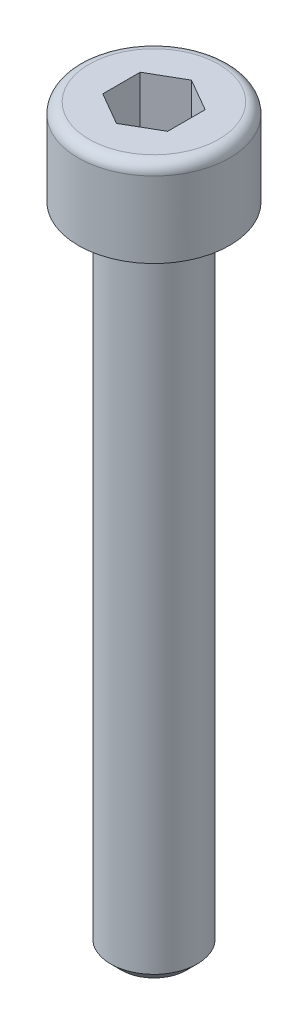
ISO-10303-21;
HEADER;
FILE_DESCRIPTION(('STEP AP214'),'2;1');
FILE_NAME('part.step','',(''),(''),'','','');
FILE_SCHEMA(('AUTOMOTIVE_DESIGN { 1 0 10303 214 1 1 1 1 }'));
ENDSEC;
DATA;
#1=APPLICATION_CONTEXT('core data for automotive mechanical design processes');
#2=APPLICATION_PROTOCOL_DEFINITION('international standard','automotive_design',2000,#1);
#3=PRODUCT_CONTEXT('',#1,'mechanical');
#4=PRODUCT('Part','Part','',(#3));
#5=PRODUCT_RELATED_PRODUCT_CATEGORY('part','',(#4));
#6=PRODUCT_DEFINITION_FORMATION('','',#4);
#7=PRODUCT_DEFINITION_CONTEXT('part definition',#1,'design');
#8=PRODUCT_DEFINITION('design','',#6,#7);
#9=PRODUCT_DEFINITION_SHAPE('','',#8);
#10=(LENGTH_UNIT() NAMED_UNIT(*) SI_UNIT(.MILLI.,.METRE.));
#11=(NAMED_UNIT(*) PLANE_ANGLE_UNIT() SI_UNIT($,.RADIAN.));
#12=(NAMED_UNIT(*) SI_UNIT($,.STERADIAN.) SOLID_ANGLE_UNIT());
#13=UNCERTAINTY_MEASURE_WITH_UNIT(LENGTH_MEASURE(1.E-05),#10,'distance_accuracy_value','');
#14=(GEOMETRIC_REPRESENTATION_CONTEXT(3) GLOBAL_UNCERTAINTY_ASSIGNED_CONTEXT((#13)) GLOBAL_UNIT_ASSIGNED_CONTEXT((#10,
#11,#12)) REPRESENTATION_CONTEXT('',''));
#15=CARTESIAN_POINT('',(0.,0.,0.));
#16=DIRECTION('',(0.,0.,1.));
#17=DIRECTION('',(1.,0.,0.));
#18=AXIS2_PLACEMENT_3D('',#15,#16,#17);
#19=CARTESIAN_POINT('',(0.,0.,0.));
#20=DIRECTION('',(0.,-1.,0.));
#21=DIRECTION('',(0.,0.,-1.));
#22=AXIS2_PLACEMENT_3D('',#19,#20,#21);
#23=PLANE('',#22);
#24=CARTESIAN_POINT('',(0.,0.,0.));
#25=DIRECTION('',(0.,-1.,0.));
#26=DIRECTION('',(0.,0.,-1.));
#27=AXIS2_PLACEMENT_3D('',#24,#25,#26);
#28=CIRCLE('',#27,3.);
#29=CARTESIAN_POINT('',(0.,0.,-3.));
#30=VERTEX_POINT('',#29);
#31=EDGE_CURVE('E42',#30,#30,#28,.F.);
#32=ORIENTED_EDGE('',*,*,#31,.T.);
#33=EDGE_LOOP('',(#32));
#34=FACE_BOUND('',#33,.T.);
#35=DIRECTION('',(-0.866025403784439,0.,-0.5));
#36=VECTOR('',#35,1.);
#37=CARTESIAN_POINT('',(1.5,0.,-0.866025403784438));
#38=LINE('',#37,#36);
#39=CARTESIAN_POINT('',(1.5,0.,-0.866025403784438));
#40=VERTEX_POINT('',#39);
#41=CARTESIAN_POINT('',(0.,0.,-1.73205080756888));
#42=VERTEX_POINT('',#41);
#43=EDGE_CURVE('E123',#40,#42,#38,.T.);
#44=ORIENTED_EDGE('',*,*,#43,.F.);
#45=DIRECTION('',(0.,0.,-1.));
#46=VECTOR('',#45,1.);
#47=CARTESIAN_POINT('',(1.5,0.,0.866025403784439));
#48=LINE('',#47,#46);
#49=CARTESIAN_POINT('',(1.5,0.,0.866025403784439));
#50=VERTEX_POINT('',#49);
#51=EDGE_CURVE('E49',#50,#40,#48,.T.);
#52=ORIENTED_EDGE('',*,*,#51,.F.);
#53=DIRECTION('',(0.866025403784439,0.,-0.5));
#54=VECTOR('',#53,1.);
#55=CARTESIAN_POINT('',(0.,0.,1.73205080756888));
#56=LINE('',#55,#54);
#57=CARTESIAN_POINT('',(0.,0.,1.73205080756888));
#58=VERTEX_POINT('',#57);
#59=EDGE_CURVE('E132',#58,#50,#56,.T.);
#60=ORIENTED_EDGE('',*,*,#59,.F.);
#61=DIRECTION('',(0.866025403784439,0.,0.5));
#62=VECTOR('',#61,1.);
#63=CARTESIAN_POINT('',(-1.5,0.,0.866025403784438));
#64=LINE('',#63,#62);
#65=CARTESIAN_POINT('',(-1.5,0.,0.866025403784438));
#66=VERTEX_POINT('',#65);
#67=EDGE_CURVE('E130',#66,#58,#64,.T.);
#68=ORIENTED_EDGE('',*,*,#67,.F.);
#69=DIRECTION('',(0.,0.,1.));
#70=VECTOR('',#69,1.);
#71=CARTESIAN_POINT('',(-1.5,0.,-0.866025403784439));
#72=LINE('',#71,#70);
#73=CARTESIAN_POINT('',(-1.5,0.,-0.866025403784439));
#74=VERTEX_POINT('',#73);
#75=EDGE_CURVE('E97',#74,#66,#72,.T.);
#76=ORIENTED_EDGE('',*,*,#75,.F.);
#77=DIRECTION('',(-0.866025403784439,0.,0.5));
#78=VECTOR('',#77,1.);
#79=CARTESIAN_POINT('',(0.,0.,-1.73205080756888));
#80=LINE('',#79,#78);
#81=EDGE_CURVE('E126',#42,#74,#80,.T.);
#82=ORIENTED_EDGE('',*,*,#81,.F.);
#83=EDGE_LOOP('',(#44,#52,#60,#68,#76,#82));
#84=FACE_BOUND('',#83,.T.);
#85=ADVANCED_FACE('F34',(#34,#84),#23,.F.);
#86=CARTESIAN_POINT('',(0.,0.,0.));
#87=DIRECTION('',(0.,1.,0.));
#88=DIRECTION('',(0.,0.,1.));
#89=AXIS2_PLACEMENT_3D('',#86,#87,#88);
#90=CYLINDRICAL_SURFACE('',#89,3.5);
#91=CARTESIAN_POINT('',(0.,-0.5,0.));
#92=DIRECTION('',(0.,-1.,0.));
#93=DIRECTION('',(0.,0.,-1.));
#94=AXIS2_PLACEMENT_3D('',#91,#92,#93);
#95=CIRCLE('',#94,3.5);
#96=CARTESIAN_POINT('',(0.,-0.5,-3.5));
#97=VERTEX_POINT('',#96);
#98=EDGE_CURVE('E11',#97,#97,#95,.T.);
#99=ORIENTED_EDGE('',*,*,#98,.T.);
#100=EDGE_LOOP('',(#99));
#101=FACE_BOUND('',#100,.T.);
#102=CARTESIAN_POINT('',(0.,-4.,0.));
#103=DIRECTION('',(0.,1.,0.));
#104=DIRECTION('',(0.,0.,1.));
#105=AXIS2_PLACEMENT_3D('',#102,#103,#104);
#106=CIRCLE('',#105,3.5);
#107=CARTESIAN_POINT('',(0.,-4.,3.5));
#108=VERTEX_POINT('',#107);
#109=EDGE_CURVE('E144',#108,#108,#106,.T.);
#110=ORIENTED_EDGE('',*,*,#109,.T.);
#111=EDGE_LOOP('',(#110));
#112=FACE_BOUND('',#111,.T.);
#113=ADVANCED_FACE('F166',(#101,#112),#90,.T.);
#114=CARTESIAN_POINT('',(3.5,-4.,0.));
#115=DIRECTION('',(0.,1.,0.));
#116=DIRECTION('',(0.,0.,1.));
#117=AXIS2_PLACEMENT_3D('',#114,#115,#116);
#118=PLANE('',#117);
#119=ORIENTED_EDGE('',*,*,#109,.F.);
#120=EDGE_LOOP('',(#119));
#121=FACE_BOUND('',#120,.T.);
#122=CARTESIAN_POINT('',(0.,-4.,0.));
#123=DIRECTION('',(0.,1.,0.));
#124=DIRECTION('',(0.,0.,1.));
#125=AXIS2_PLACEMENT_3D('',#122,#123,#124);
#126=CIRCLE('',#125,2.);
#127=CARTESIAN_POINT('',(0.,-4.,2.));
#128=VERTEX_POINT('',#127);
#129=EDGE_CURVE('E136',#128,#128,#126,.T.);
#130=ORIENTED_EDGE('',*,*,#129,.T.);
#131=EDGE_LOOP('',(#130));
#132=FACE_BOUND('',#131,.T.);
#133=ADVANCED_FACE('F171',(#121,#132),#118,.F.);
#134=CARTESIAN_POINT('',(0.,0.,0.));
#135=DIRECTION('',(0.,1.,0.));
#136=DIRECTION('',(0.,0.,1.));
#137=AXIS2_PLACEMENT_3D('',#134,#135,#136);
#138=CYLINDRICAL_SURFACE('',#137,2.);
#139=CARTESIAN_POINT('',(0.,-33.5,0.));
#140=DIRECTION('',(0.,1.,0.));
#141=DIRECTION('',(0.,0.,1.));
#142=AXIS2_PLACEMENT_3D('',#139,#140,#141);
#143=CIRCLE('',#142,2.);
#144=CARTESIAN_POINT('',(0.,-33.5,2.));
#145=VERTEX_POINT('',#144);
#146=EDGE_CURVE('E147',#145,#145,#143,.T.);
#147=ORIENTED_EDGE('',*,*,#146,.T.);
#148=EDGE_LOOP('',(#147));
#149=FACE_BOUND('',#148,.T.);
#150=ORIENTED_EDGE('',*,*,#129,.F.);
#151=EDGE_LOOP('',(#150));
#152=FACE_BOUND('',#151,.T.);
#153=ADVANCED_FACE('F177',(#149,#152),#138,.T.);
#154=CARTESIAN_POINT('',(2.,-34.,0.));
#155=DIRECTION('',(0.,1.,0.));
#156=DIRECTION('',(0.,0.,1.));
#157=AXIS2_PLACEMENT_3D('',#154,#155,#156);
#158=PLANE('',#157);
#159=CARTESIAN_POINT('',(0.,-34.,0.));
#160=DIRECTION('',(0.,1.,0.));
#161=DIRECTION('',(0.,0.,1.));
#162=AXIS2_PLACEMENT_3D('',#159,#160,#161);
#163=CIRCLE('',#162,1.5);
#164=CARTESIAN_POINT('',(0.,-34.,1.5));
#165=VERTEX_POINT('',#164);
#166=EDGE_CURVE('E150',#165,#165,#163,.F.);
#167=ORIENTED_EDGE('',*,*,#166,.T.);
#168=EDGE_LOOP('',(#167));
#169=FACE_BOUND('',#168,.T.);
#170=ADVANCED_FACE('F181',(#169),#158,.F.);
#171=CARTESIAN_POINT('',(1.5,-3.,0.866025403784439));
#172=DIRECTION('',(1.,0.,0.));
#173=DIRECTION('',(0.,0.,-1.));
#174=AXIS2_PLACEMENT_3D('',#171,#172,#173);
#175=PLANE('',#174);
#176=ORIENTED_EDGE('',*,*,#51,.T.);
#177=DIRECTION('',(0.,1.,0.));
#178=VECTOR('',#177,1.);
#179=CARTESIAN_POINT('',(1.5,-3.,-0.866025403784438));
#180=LINE('',#179,#178);
#181=CARTESIAN_POINT('',(1.5,-3.,-0.866025403784438));
#182=VERTEX_POINT('',#181);
#183=EDGE_CURVE('E79',#182,#40,#180,.T.);
#184=ORIENTED_EDGE('',*,*,#183,.F.);
#185=DIRECTION('',(0.,0.,-1.));
#186=VECTOR('',#185,1.);
#187=CARTESIAN_POINT('',(1.5,-3.,0.866025403784439));
#188=LINE('',#187,#186);
#189=CARTESIAN_POINT('',(1.5,-3.,0.866025403784439));
#190=VERTEX_POINT('',#189);
#191=EDGE_CURVE('E134',#190,#182,#188,.T.);
#192=ORIENTED_EDGE('',*,*,#191,.F.);
#193=DIRECTION('',(0.,1.,0.));
#194=VECTOR('',#193,1.);
#195=CARTESIAN_POINT('',(1.5,-3.,0.866025403784439));
#196=LINE('',#195,#194);
#197=EDGE_CURVE('E57',#190,#50,#196,.T.);
#198=ORIENTED_EDGE('',*,*,#197,.T.);
#199=EDGE_LOOP('',(#176,#184,#192,#198));
#200=FACE_BOUND('',#199,.T.);
#201=ADVANCED_FACE('F185',(#200),#175,.F.);
#202=CARTESIAN_POINT('',(0.,-3.,1.73205080756888));
#203=DIRECTION('',(0.5,0.,0.866025403784439));
#204=DIRECTION('',(0.866025403784439,0.,-0.5));
#205=AXIS2_PLACEMENT_3D('',#202,#203,#204);
#206=PLANE('',#205);
#207=ORIENTED_EDGE('',*,*,#59,.T.);
#208=ORIENTED_EDGE('',*,*,#197,.F.);
#209=DIRECTION('',(0.866025403784439,0.,-0.5));
#210=VECTOR('',#209,1.);
#211=CARTESIAN_POINT('',(0.,-3.,1.73205080756888));
#212=LINE('',#211,#210);
#213=CARTESIAN_POINT('',(0.,-3.,1.73205080756888));
#214=VERTEX_POINT('',#213);
#215=EDGE_CURVE('E109',#214,#190,#212,.T.);
#216=ORIENTED_EDGE('',*,*,#215,.F.);
#217=DIRECTION('',(0.,1.,0.));
#218=VECTOR('',#217,1.);
#219=CARTESIAN_POINT('',(0.,-3.,1.73205080756888));
#220=LINE('',#219,#218);
#221=EDGE_CURVE('E101',#214,#58,#220,.T.);
#222=ORIENTED_EDGE('',*,*,#221,.T.);
#223=EDGE_LOOP('',(#207,#208,#216,#222));
#224=FACE_BOUND('',#223,.T.);
#225=ADVANCED_FACE('F189',(#224),#206,.F.);
#226=CARTESIAN_POINT('',(-1.5,-3.,0.866025403784438));
#227=DIRECTION('',(-0.5,0.,0.866025403784438));
#228=DIRECTION('',(0.866025403784439,0.,0.5));
#229=AXIS2_PLACEMENT_3D('',#226,#227,#228);
#230=PLANE('',#229);
#231=ORIENTED_EDGE('',*,*,#67,.T.);
#232=ORIENTED_EDGE('',*,*,#221,.F.);
#233=DIRECTION('',(0.866025403784439,0.,0.5));
#234=VECTOR('',#233,1.);
#235=CARTESIAN_POINT('',(-1.5,-3.,0.866025403784438));
#236=LINE('',#235,#234);
#237=CARTESIAN_POINT('',(-1.5,-3.,0.866025403784438));
#238=VERTEX_POINT('',#237);
#239=EDGE_CURVE('E105',#238,#214,#236,.T.);
#240=ORIENTED_EDGE('',*,*,#239,.F.);
#241=DIRECTION('',(0.,1.,0.));
#242=VECTOR('',#241,1.);
#243=CARTESIAN_POINT('',(-1.5,-3.,0.866025403784438));
#244=LINE('',#243,#242);
#245=EDGE_CURVE('E90',#238,#66,#244,.T.);
#246=ORIENTED_EDGE('',*,*,#245,.T.);
#247=EDGE_LOOP('',(#231,#232,#240,#246));
#248=FACE_BOUND('',#247,.T.);
#249=ADVANCED_FACE('F106',(#248),#230,.F.);
#250=CARTESIAN_POINT('',(-1.5,-3.,-0.866025403784439));
#251=DIRECTION('',(-1.,0.,0.));
#252=DIRECTION('',(0.,0.,1.));
#253=AXIS2_PLACEMENT_3D('',#250,#251,#252);
#254=PLANE('',#253);
#255=ORIENTED_EDGE('',*,*,#75,.T.);
#256=ORIENTED_EDGE('',*,*,#245,.F.);
#257=DIRECTION('',(0.,0.,1.));
#258=VECTOR('',#257,1.);
#259=CARTESIAN_POINT('',(-1.5,-3.,-0.866025403784439));
#260=LINE('',#259,#258);
#261=CARTESIAN_POINT('',(-1.5,-3.,-0.866025403784439));
#262=VERTEX_POINT('',#261);
#263=EDGE_CURVE('E94',#262,#238,#260,.T.);
#264=ORIENTED_EDGE('',*,*,#263,.F.);
#265=DIRECTION('',(0.,1.,0.));
#266=VECTOR('',#265,1.);
#267=CARTESIAN_POINT('',(-1.5,-3.,-0.866025403784439));
#268=LINE('',#267,#266);
#269=EDGE_CURVE('E102',#262,#74,#268,.T.);
#270=ORIENTED_EDGE('',*,*,#269,.T.);
#271=EDGE_LOOP('',(#255,#256,#264,#270));
#272=FACE_BOUND('',#271,.T.);
#273=ADVANCED_FACE('F92',(#272),#254,.F.);
#274=CARTESIAN_POINT('',(0.,-3.,-1.73205080756888));
#275=DIRECTION('',(-0.5,0.,-0.866025403784439));
#276=DIRECTION('',(-0.866025403784439,0.,0.5));
#277=AXIS2_PLACEMENT_3D('',#274,#275,#276);
#278=PLANE('',#277);
#279=ORIENTED_EDGE('',*,*,#81,.T.);
#280=ORIENTED_EDGE('',*,*,#269,.F.);
#281=DIRECTION('',(-0.866025403784439,0.,0.5));
#282=VECTOR('',#281,1.);
#283=CARTESIAN_POINT('',(0.,-3.,-1.73205080756888));
#284=LINE('',#283,#282);
#285=CARTESIAN_POINT('',(0.,-3.,-1.73205080756888));
#286=VERTEX_POINT('',#285);
#287=EDGE_CURVE('E115',#286,#262,#284,.T.);
#288=ORIENTED_EDGE('',*,*,#287,.F.);
#289=DIRECTION('',(0.,1.,0.));
#290=VECTOR('',#289,1.);
#291=CARTESIAN_POINT('',(0.,-3.,-1.73205080756888));
#292=LINE('',#291,#290);
#293=EDGE_CURVE('E139',#286,#42,#292,.T.);
#294=ORIENTED_EDGE('',*,*,#293,.T.);
#295=EDGE_LOOP('',(#279,#280,#288,#294));
#296=FACE_BOUND('',#295,.T.);
#297=ADVANCED_FACE('F193',(#296),#278,.F.);
#298=CARTESIAN_POINT('',(1.5,-3.,-0.866025403784438));
#299=DIRECTION('',(0.5,0.,-0.866025403784439));
#300=DIRECTION('',(-0.866025403784439,0.,-0.5));
#301=AXIS2_PLACEMENT_3D('',#298,#299,#300);
#302=PLANE('',#301);
#303=ORIENTED_EDGE('',*,*,#43,.T.);
#304=ORIENTED_EDGE('',*,*,#293,.F.);
#305=DIRECTION('',(-0.866025403784439,0.,-0.5));
#306=VECTOR('',#305,1.);
#307=CARTESIAN_POINT('',(1.5,-3.,-0.866025403784438));
#308=LINE('',#307,#306);
#309=EDGE_CURVE('E117',#182,#286,#308,.T.);
#310=ORIENTED_EDGE('',*,*,#309,.F.);
#311=ORIENTED_EDGE('',*,*,#183,.T.);
#312=EDGE_LOOP('',(#303,#304,#310,#311));
#313=FACE_BOUND('',#312,.T.);
#314=ADVANCED_FACE('F190',(#313),#302,.F.);
#315=CARTESIAN_POINT('',(1.5,-3.,-0.866025403784438));
#316=DIRECTION('',(0.,1.,0.));
#317=DIRECTION('',(0.,0.,1.));
#318=AXIS2_PLACEMENT_3D('',#315,#316,#317);
#319=PLANE('',#318);
#320=ORIENTED_EDGE('',*,*,#191,.T.);
#321=ORIENTED_EDGE('',*,*,#309,.T.);
#322=ORIENTED_EDGE('',*,*,#287,.T.);
#323=ORIENTED_EDGE('',*,*,#263,.T.);
#324=ORIENTED_EDGE('',*,*,#239,.T.);
#325=ORIENTED_EDGE('',*,*,#215,.T.);
#326=EDGE_LOOP('',(#320,#321,#322,#323,#324,#325));
#327=FACE_BOUND('',#326,.T.);
#328=ADVANCED_FACE('F112',(#327),#319,.T.);
#329=CARTESIAN_POINT('',(0.,-33.5,0.));
#330=DIRECTION('',(0.,1.,0.));
#331=DIRECTION('',(0.,0.,1.));
#332=AXIS2_PLACEMENT_3D('',#329,#330,#331);
#333=CONICAL_SURFACE('',#332,2.,0.785398163397452);
#334=ORIENTED_EDGE('',*,*,#166,.F.);
#335=EDGE_LOOP('',(#334));
#336=FACE_BOUND('',#335,.T.);
#337=ORIENTED_EDGE('',*,*,#146,.F.);
#338=EDGE_LOOP('',(#337));
#339=FACE_BOUND('',#338,.T.);
#340=ADVANCED_FACE('F158',(#336,#339),#333,.T.);
#341=CARTESIAN_POINT('',(0.,-0.5,0.));
#342=DIRECTION('',(0.,-1.,0.));
#343=DIRECTION('',(0.,0.,-1.));
#344=AXIS2_PLACEMENT_3D('',#341,#342,#343);
#345=TOROIDAL_SURFACE('',#344,3.,0.5);
#346=ORIENTED_EDGE('',*,*,#98,.F.);
#347=EDGE_LOOP('',(#346));
#348=FACE_BOUND('',#347,.T.);
#349=ORIENTED_EDGE('',*,*,#31,.F.);
#350=EDGE_LOOP('',(#349));
#351=FACE_BOUND('',#350,.T.);
#352=ADVANCED_FACE('F36',(#348,#351),#345,.T.);
#353=CLOSED_SHELL('',(#85,#113,#133,#153,#170,#201,#225,#249,#273,#297,#314,#328,#340,#352));
#354=MANIFOLD_SOLID_BREP('B2',#353);
#355=ADVANCED_BREP_SHAPE_REPRESENTATION('',(#18,#354),#14);
#356=SHAPE_DEFINITION_REPRESENTATION(#9,#355);
ENDSEC;
END-ISO-10303-21;
